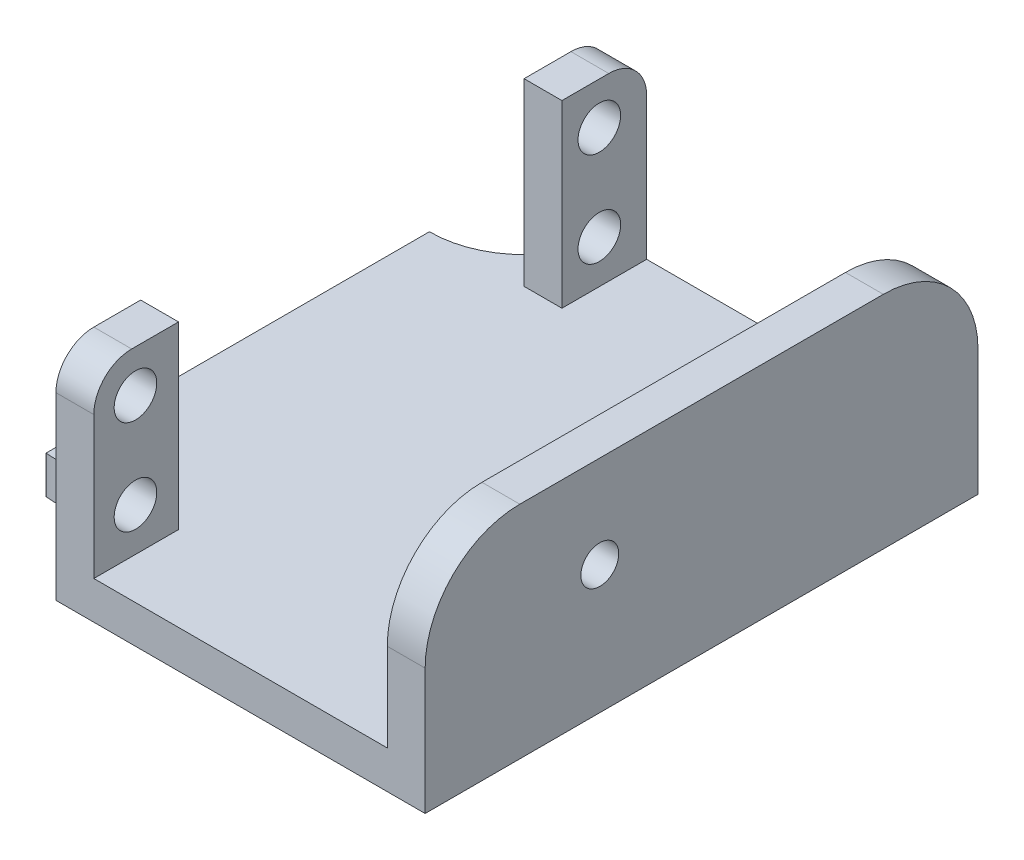
ISO-10303-21;
HEADER;
FILE_DESCRIPTION(('STEP AP214'),'2;1');
FILE_NAME('part.step','',(''),(''),'','','');
FILE_SCHEMA(('AUTOMOTIVE_DESIGN { 1 0 10303 214 1 1 1 1 }'));
ENDSEC;
DATA;
#1=APPLICATION_CONTEXT('core data for automotive mechanical design processes');
#2=APPLICATION_PROTOCOL_DEFINITION('international standard','automotive_design',2000,#1);
#3=PRODUCT_CONTEXT('',#1,'mechanical');
#4=PRODUCT('Part','Part','',(#3));
#5=PRODUCT_RELATED_PRODUCT_CATEGORY('part','',(#4));
#6=PRODUCT_DEFINITION_FORMATION('','',#4);
#7=PRODUCT_DEFINITION_CONTEXT('part definition',#1,'design');
#8=PRODUCT_DEFINITION('design','',#6,#7);
#9=PRODUCT_DEFINITION_SHAPE('','',#8);
#10=(LENGTH_UNIT() NAMED_UNIT(*) SI_UNIT(.MILLI.,.METRE.));
#11=(NAMED_UNIT(*) PLANE_ANGLE_UNIT() SI_UNIT($,.RADIAN.));
#12=(NAMED_UNIT(*) SI_UNIT($,.STERADIAN.) SOLID_ANGLE_UNIT());
#13=UNCERTAINTY_MEASURE_WITH_UNIT(LENGTH_MEASURE(1.E-05),#10,'distance_accuracy_value','');
#14=(GEOMETRIC_REPRESENTATION_CONTEXT(3) GLOBAL_UNCERTAINTY_ASSIGNED_CONTEXT((#13)) GLOBAL_UNIT_ASSIGNED_CONTEXT((#10,
#11,#12)) REPRESENTATION_CONTEXT('',''));
#15=CARTESIAN_POINT('',(0.,0.,0.));
#16=DIRECTION('',(0.,0.,1.));
#17=DIRECTION('',(1.,0.,0.));
#18=AXIS2_PLACEMENT_3D('',#15,#16,#17);
#19=CARTESIAN_POINT('',(0.,4.,0.));
#20=DIRECTION('',(0.,-1.,0.));
#21=DIRECTION('',(0.,0.,-1.));
#22=AXIS2_PLACEMENT_3D('',#19,#20,#21);
#23=PLANE('',#22);
#24=DIRECTION('',(0.,0.,-1.));
#25=VECTOR('',#24,1.);
#26=CARTESIAN_POINT('',(-4.,4.,0.));
#27=LINE('',#26,#25);
#28=CARTESIAN_POINT('',(-4.,4.,0.));
#29=VERTEX_POINT('',#28);
#30=CARTESIAN_POINT('',(-4.,4.,-58.4));
#31=VERTEX_POINT('',#30);
#32=EDGE_CURVE('E198',#29,#31,#27,.T.);
#33=ORIENTED_EDGE('',*,*,#32,.T.);
#34=DIRECTION('',(-1.,0.,0.));
#35=VECTOR('',#34,1.);
#36=CARTESIAN_POINT('',(-39.,4.,-58.4));
#37=LINE('',#36,#35);
#38=CARTESIAN_POINT('',(-35.,4.,-58.4));
#39=VERTEX_POINT('',#38);
#40=EDGE_CURVE('E184',#31,#39,#37,.T.);
#41=ORIENTED_EDGE('',*,*,#40,.T.);
#42=DIRECTION('',(0.,0.,1.));
#43=VECTOR('',#42,1.);
#44=CARTESIAN_POINT('',(-35.,4.,-58.4));
#45=LINE('',#44,#43);
#46=CARTESIAN_POINT('',(-35.,4.,-49.45));
#47=VERTEX_POINT('',#46);
#48=EDGE_CURVE('E228',#39,#47,#45,.T.);
#49=ORIENTED_EDGE('',*,*,#48,.T.);
#50=DIRECTION('',(-1.,0.,0.));
#51=VECTOR('',#50,1.);
#52=CARTESIAN_POINT('',(-35.,4.,-49.45));
#53=LINE('',#52,#51);
#54=CARTESIAN_POINT('',(-39.,4.,-49.45));
#55=VERTEX_POINT('',#54);
#56=EDGE_CURVE('E237',#47,#55,#53,.T.);
#57=ORIENTED_EDGE('',*,*,#56,.T.);
#58=DIRECTION('',(0.,0.,1.));
#59=VECTOR('',#58,1.);
#60=CARTESIAN_POINT('',(-39.,4.,0.));
#61=LINE('',#60,#59);
#62=CARTESIAN_POINT('',(-39.,4.,-58.4));
#63=VERTEX_POINT('',#62);
#64=EDGE_CURVE('E323',#63,#55,#61,.T.);
#65=ORIENTED_EDGE('',*,*,#64,.F.);
#66=CARTESIAN_POINT('',(-48.9447222183428,4.,-59.45));
#67=DIRECTION('',(0.,-1.,0.));
#68=DIRECTION('',(0.,0.,-1.));
#69=AXIS2_PLACEMENT_3D('',#66,#67,#68);
#70=CIRCLE('',#69,10.);
#71=CARTESIAN_POINT('',(-48.9447222183428,4.,-49.45));
#72=VERTEX_POINT('',#71);
#73=EDGE_CURVE('E332',#63,#72,#70,.T.);
#74=ORIENTED_EDGE('',*,*,#73,.T.);
#75=DIRECTION('',(-1.,0.,0.));
#76=VECTOR('',#75,1.);
#77=CARTESIAN_POINT('',(-49.,4.,-49.45));
#78=LINE('',#77,#76);
#79=CARTESIAN_POINT('',(-49.,4.,-49.45));
#80=VERTEX_POINT('',#79);
#81=EDGE_CURVE('E193',#72,#80,#78,.T.);
#82=ORIENTED_EDGE('',*,*,#81,.T.);
#83=DIRECTION('',(0.,0.,1.));
#84=VECTOR('',#83,1.);
#85=CARTESIAN_POINT('',(-49.,4.,-8.95));
#86=LINE('',#85,#84);
#87=CARTESIAN_POINT('',(-49.,4.,-8.95));
#88=VERTEX_POINT('',#87);
#89=EDGE_CURVE('E280',#80,#88,#86,.T.);
#90=ORIENTED_EDGE('',*,*,#89,.T.);
#91=DIRECTION('',(1.,0.,0.));
#92=VECTOR('',#91,1.);
#93=CARTESIAN_POINT('',(-39.,4.,-8.95));
#94=LINE('',#93,#92);
#95=CARTESIAN_POINT('',(-48.9447222183428,4.,-8.95));
#96=VERTEX_POINT('',#95);
#97=EDGE_CURVE('E283',#88,#96,#94,.T.);
#98=ORIENTED_EDGE('',*,*,#97,.T.);
#99=CARTESIAN_POINT('',(-48.9447222183428,4.,1.05000000000001));
#100=DIRECTION('',(0.,-1.,0.));
#101=DIRECTION('',(0.,0.,-1.));
#102=AXIS2_PLACEMENT_3D('',#99,#100,#101);
#103=CIRCLE('',#102,10.);
#104=CARTESIAN_POINT('',(-39.,4.,0.));
#105=VERTEX_POINT('',#104);
#106=EDGE_CURVE('E336',#96,#105,#103,.T.);
#107=ORIENTED_EDGE('',*,*,#106,.T.);
#108=DIRECTION('',(0.,0.,1.));
#109=VECTOR('',#108,1.);
#110=CARTESIAN_POINT('',(-39.,4.,0.));
#111=LINE('',#110,#109);
#112=CARTESIAN_POINT('',(-39.,4.,-8.95));
#113=VERTEX_POINT('',#112);
#114=EDGE_CURVE('E325',#113,#105,#111,.T.);
#115=ORIENTED_EDGE('',*,*,#114,.F.);
#116=DIRECTION('',(-1.,0.,0.));
#117=VECTOR('',#116,1.);
#118=CARTESIAN_POINT('',(-35.,4.,-8.95));
#119=LINE('',#118,#117);
#120=CARTESIAN_POINT('',(-35.,4.,-8.95));
#121=VERTEX_POINT('',#120);
#122=EDGE_CURVE('E270',#121,#113,#119,.T.);
#123=ORIENTED_EDGE('',*,*,#122,.F.);
#124=DIRECTION('',(0.,0.,1.));
#125=VECTOR('',#124,1.);
#126=CARTESIAN_POINT('',(-35.,4.,-8.95));
#127=LINE('',#126,#125);
#128=CARTESIAN_POINT('',(-35.,4.,0.));
#129=VERTEX_POINT('',#128);
#130=EDGE_CURVE('E262',#121,#129,#127,.T.);
#131=ORIENTED_EDGE('',*,*,#130,.T.);
#132=DIRECTION('',(1.,0.,0.));
#133=VECTOR('',#132,1.);
#134=CARTESIAN_POINT('',(0.,4.,0.));
#135=LINE('',#134,#133);
#136=EDGE_CURVE('E194',#129,#29,#135,.T.);
#137=ORIENTED_EDGE('',*,*,#136,.T.);
#138=EDGE_LOOP('',(#33,#41,#49,#57,#65,#74,#82,#90,#98,#107,#115,#123,#131,#137));
#139=FACE_BOUND('',#138,.T.);
#140=ADVANCED_FACE('F39',(#139),#23,.F.);
#141=CARTESIAN_POINT('',(-49.,4.,-8.95));
#142=DIRECTION('',(1.,0.,0.));
#143=DIRECTION('',(0.,0.,-1.));
#144=AXIS2_PLACEMENT_3D('',#141,#142,#143);
#145=PLANE('',#144);
#146=DIRECTION('',(0.,0.,1.));
#147=VECTOR('',#146,1.);
#148=CARTESIAN_POINT('',(-49.,0.,-8.95));
#149=LINE('',#148,#147);
#150=CARTESIAN_POINT('',(-49.,0.,-49.45));
#151=VERTEX_POINT('',#150);
#152=CARTESIAN_POINT('',(-49.,0.,-8.95));
#153=VERTEX_POINT('',#152);
#154=EDGE_CURVE('E277',#151,#153,#149,.T.);
#155=ORIENTED_EDGE('',*,*,#154,.T.);
#156=DIRECTION('',(0.,-1.,0.));
#157=VECTOR('',#156,1.);
#158=CARTESIAN_POINT('',(-49.,4.,-8.95));
#159=LINE('',#158,#157);
#160=EDGE_CURVE('E317',#88,#153,#159,.T.);
#161=ORIENTED_EDGE('',*,*,#160,.F.);
#162=ORIENTED_EDGE('',*,*,#89,.F.);
#163=DIRECTION('',(0.,-1.,0.));
#164=VECTOR('',#163,1.);
#165=CARTESIAN_POINT('',(-49.,4.,-49.45));
#166=LINE('',#165,#164);
#167=EDGE_CURVE('E289',#80,#151,#166,.T.);
#168=ORIENTED_EDGE('',*,*,#167,.T.);
#169=EDGE_LOOP('',(#155,#161,#162,#168));
#170=FACE_BOUND('',#169,.T.);
#171=ADVANCED_FACE('F397',(#170),#145,.F.);
#172=CARTESIAN_POINT('',(-39.,4.,-8.95));
#173=DIRECTION('',(0.,0.,-1.));
#174=DIRECTION('',(-1.,0.,0.));
#175=AXIS2_PLACEMENT_3D('',#172,#173,#174);
#176=PLANE('',#175);
#177=DIRECTION('',(1.,0.,0.));
#178=VECTOR('',#177,1.);
#179=CARTESIAN_POINT('',(-39.,0.,-8.95));
#180=LINE('',#179,#178);
#181=CARTESIAN_POINT('',(-48.9447222183428,0.,-8.95));
#182=VERTEX_POINT('',#181);
#183=EDGE_CURVE('E292',#153,#182,#180,.T.);
#184=ORIENTED_EDGE('',*,*,#183,.T.);
#185=DIRECTION('',(0.,1.,0.));
#186=VECTOR('',#185,1.);
#187=CARTESIAN_POINT('',(-48.9447222183428,4.,-8.95));
#188=LINE('',#187,#186);
#189=EDGE_CURVE('E328',#182,#96,#188,.T.);
#190=ORIENTED_EDGE('',*,*,#189,.T.);
#191=ORIENTED_EDGE('',*,*,#97,.F.);
#192=ORIENTED_EDGE('',*,*,#160,.T.);
#193=EDGE_LOOP('',(#184,#190,#191,#192));
#194=FACE_BOUND('',#193,.T.);
#195=ADVANCED_FACE('F402',(#194),#176,.F.);
#196=CARTESIAN_POINT('',(-39.,4.,0.));
#197=DIRECTION('',(1.,0.,0.));
#198=DIRECTION('',(0.,0.,-1.));
#199=AXIS2_PLACEMENT_3D('',#196,#197,#198);
#200=PLANE('',#199);
#201=DIRECTION('',(0.,-1.,0.));
#202=VECTOR('',#201,1.);
#203=CARTESIAN_POINT('',(-39.,4.,0.));
#204=LINE('',#203,#202);
#205=CARTESIAN_POINT('',(-39.,19.,0.));
#206=VERTEX_POINT('',#205);
#207=EDGE_CURVE('E315',#206,#105,#204,.T.);
#208=ORIENTED_EDGE('',*,*,#207,.F.);
#209=CARTESIAN_POINT('',(-39.,19.,-3.99999999999999));
#210=DIRECTION('',(1.,0.,0.));
#211=DIRECTION('',(0.,0.,-1.));
#212=AXIS2_PLACEMENT_3D('',#209,#210,#211);
#213=CIRCLE('',#212,4.);
#214=CARTESIAN_POINT('',(-39.,23.,-3.99999999999999));
#215=VERTEX_POINT('',#214);
#216=EDGE_CURVE('E351',#206,#215,#213,.F.);
#217=ORIENTED_EDGE('',*,*,#216,.T.);
#218=DIRECTION('',(0.,0.,-1.));
#219=VECTOR('',#218,1.);
#220=CARTESIAN_POINT('',(-39.,23.,-8.95));
#221=LINE('',#220,#219);
#222=CARTESIAN_POINT('',(-39.,23.,-8.95));
#223=VERTEX_POINT('',#222);
#224=EDGE_CURVE('E263',#215,#223,#221,.T.);
#225=ORIENTED_EDGE('',*,*,#224,.T.);
#226=DIRECTION('',(0.,-1.,0.));
#227=VECTOR('',#226,1.);
#228=CARTESIAN_POINT('',(-39.,23.,-8.95));
#229=LINE('',#228,#227);
#230=EDGE_CURVE('E256',#223,#113,#229,.T.);
#231=ORIENTED_EDGE('',*,*,#230,.T.);
#232=ORIENTED_EDGE('',*,*,#114,.T.);
#233=EDGE_LOOP('',(#208,#217,#225,#231,#232));
#234=FACE_BOUND('',#233,.T.);
#235=CARTESIAN_POINT('',(-39.,8.55,-4.39999999999999));
#236=DIRECTION('',(-1.,0.,0.));
#237=DIRECTION('',(0.,0.,1.));
#238=AXIS2_PLACEMENT_3D('',#235,#236,#237);
#239=CIRCLE('',#238,2.25);
#240=CARTESIAN_POINT('',(-39.,8.55,-2.14999999999999));
#241=VERTEX_POINT('',#240);
#242=EDGE_CURVE('E244',#241,#241,#239,.T.);
#243=ORIENTED_EDGE('',*,*,#242,.F.);
#244=EDGE_LOOP('',(#243));
#245=FACE_BOUND('',#244,.T.);
#246=CARTESIAN_POINT('',(-39.,18.55,-4.39999999999999));
#247=DIRECTION('',(-1.,0.,0.));
#248=DIRECTION('',(0.,0.,1.));
#249=AXIS2_PLACEMENT_3D('',#246,#247,#248);
#250=CIRCLE('',#249,2.25);
#251=CARTESIAN_POINT('',(-39.,18.55,-2.14999999999998));
#252=VERTEX_POINT('',#251);
#253=EDGE_CURVE('E250',#252,#252,#250,.T.);
#254=ORIENTED_EDGE('',*,*,#253,.F.);
#255=EDGE_LOOP('',(#254));
#256=FACE_BOUND('',#255,.T.);
#257=ADVANCED_FACE('F425',(#234,#245,#256),#200,.F.);
#258=CARTESIAN_POINT('',(0.,4.,0.));
#259=DIRECTION('',(0.,0.,-1.));
#260=DIRECTION('',(-1.,0.,0.));
#261=AXIS2_PLACEMENT_3D('',#258,#259,#260);
#262=PLANE('',#261);
#263=DIRECTION('',(0.,-1.,0.));
#264=VECTOR('',#263,1.);
#265=CARTESIAN_POINT('',(0.,4.,0.));
#266=LINE('',#265,#264);
#267=CARTESIAN_POINT('',(0.,13.3,0.));
#268=VERTEX_POINT('',#267);
#269=CARTESIAN_POINT('',(0.,0.,0.));
#270=VERTEX_POINT('',#269);
#271=EDGE_CURVE('E312',#268,#270,#266,.T.);
#272=ORIENTED_EDGE('',*,*,#271,.F.);
#273=DIRECTION('',(1.,0.,0.));
#274=VECTOR('',#273,1.);
#275=CARTESIAN_POINT('',(-4.,13.3,0.));
#276=LINE('',#275,#274);
#277=CARTESIAN_POINT('',(-4.,13.3,0.));
#278=VERTEX_POINT('',#277);
#279=EDGE_CURVE('E62',#268,#278,#276,.F.);
#280=ORIENTED_EDGE('',*,*,#279,.T.);
#281=DIRECTION('',(0.,-1.,0.));
#282=VECTOR('',#281,1.);
#283=CARTESIAN_POINT('',(-4.,23.3,0.));
#284=LINE('',#283,#282);
#285=EDGE_CURVE('E201',#278,#29,#284,.T.);
#286=ORIENTED_EDGE('',*,*,#285,.T.);
#287=ORIENTED_EDGE('',*,*,#136,.F.);
#288=DIRECTION('',(0.,1.,0.));
#289=VECTOR('',#288,1.);
#290=CARTESIAN_POINT('',(-35.,23.,0.));
#291=LINE('',#290,#289);
#292=CARTESIAN_POINT('',(-35.,19.,0.));
#293=VERTEX_POINT('',#292);
#294=EDGE_CURVE('E265',#129,#293,#291,.T.);
#295=ORIENTED_EDGE('',*,*,#294,.T.);
#296=DIRECTION('',(-1.,0.,0.));
#297=VECTOR('',#296,1.);
#298=CARTESIAN_POINT('',(-39.,19.,0.));
#299=LINE('',#298,#297);
#300=EDGE_CURVE('E348',#293,#206,#299,.T.);
#301=ORIENTED_EDGE('',*,*,#300,.T.);
#302=ORIENTED_EDGE('',*,*,#207,.T.);
#303=CARTESIAN_POINT('',(-39.,0.,0.));
#304=VERTEX_POINT('',#303);
#305=EDGE_CURVE('E314',#105,#304,#204,.T.);
#306=ORIENTED_EDGE('',*,*,#305,.T.);
#307=DIRECTION('',(1.,0.,0.));
#308=VECTOR('',#307,1.);
#309=CARTESIAN_POINT('',(0.,0.,0.));
#310=LINE('',#309,#308);
#311=EDGE_CURVE('E295',#304,#270,#310,.T.);
#312=ORIENTED_EDGE('',*,*,#311,.T.);
#313=EDGE_LOOP('',(#272,#280,#286,#287,#295,#301,#302,#306,#312));
#314=FACE_BOUND('',#313,.T.);
#315=ADVANCED_FACE('F378',(#314),#262,.F.);
#316=CARTESIAN_POINT('',(0.,4.,-58.4));
#317=DIRECTION('',(-1.,0.,0.));
#318=DIRECTION('',(0.,0.,1.));
#319=AXIS2_PLACEMENT_3D('',#316,#317,#318);
#320=PLANE('',#319);
#321=DIRECTION('',(0.,0.,1.));
#322=VECTOR('',#321,1.);
#323=CARTESIAN_POINT('',(0.,23.3,0.));
#324=LINE('',#323,#322);
#325=CARTESIAN_POINT('',(0.,23.3,-48.4));
#326=VERTEX_POINT('',#325);
#327=CARTESIAN_POINT('',(0.,23.3,-9.99999999999999));
#328=VERTEX_POINT('',#327);
#329=EDGE_CURVE('E211',#326,#328,#324,.T.);
#330=ORIENTED_EDGE('',*,*,#329,.T.);
#331=CARTESIAN_POINT('',(0.,13.3,-9.99999999999999));
#332=DIRECTION('',(-1.,0.,0.));
#333=DIRECTION('',(0.,0.,1.));
#334=AXIS2_PLACEMENT_3D('',#331,#332,#333);
#335=CIRCLE('',#334,10.);
#336=EDGE_CURVE('E364',#328,#268,#335,.F.);
#337=ORIENTED_EDGE('',*,*,#336,.T.);
#338=ORIENTED_EDGE('',*,*,#271,.T.);
#339=DIRECTION('',(0.,0.,-1.));
#340=VECTOR('',#339,1.);
#341=CARTESIAN_POINT('',(0.,0.,-58.4));
#342=LINE('',#341,#340);
#343=CARTESIAN_POINT('',(0.,0.,-58.4));
#344=VERTEX_POINT('',#343);
#345=EDGE_CURVE('E298',#270,#344,#342,.T.);
#346=ORIENTED_EDGE('',*,*,#345,.T.);
#347=DIRECTION('',(0.,-1.,0.));
#348=VECTOR('',#347,1.);
#349=CARTESIAN_POINT('',(0.,4.,-58.4));
#350=LINE('',#349,#348);
#351=CARTESIAN_POINT('',(0.,13.3,-58.4));
#352=VERTEX_POINT('',#351);
#353=EDGE_CURVE('E310',#352,#344,#350,.T.);
#354=ORIENTED_EDGE('',*,*,#353,.F.);
#355=CARTESIAN_POINT('',(0.,13.3,-48.4));
#356=DIRECTION('',(-1.,0.,0.));
#357=DIRECTION('',(0.,0.,1.));
#358=AXIS2_PLACEMENT_3D('',#355,#356,#357);
#359=CIRCLE('',#358,10.);
#360=EDGE_CURVE('E362',#352,#326,#359,.F.);
#361=ORIENTED_EDGE('',*,*,#360,.T.);
#362=EDGE_LOOP('',(#330,#337,#338,#346,#354,#361));
#363=FACE_BOUND('',#362,.T.);
#364=CARTESIAN_POINT('',(0.,13.55,-18.45));
#365=DIRECTION('',(1.,0.,0.));
#366=DIRECTION('',(0.,0.,-1.));
#367=AXIS2_PLACEMENT_3D('',#364,#365,#366);
#368=CIRCLE('',#367,2.);
#369=CARTESIAN_POINT('',(0.,13.55,-20.45));
#370=VERTEX_POINT('',#369);
#371=EDGE_CURVE('E461',#370,#370,#368,.T.);
#372=ORIENTED_EDGE('',*,*,#371,.F.);
#373=EDGE_LOOP('',(#372));
#374=FACE_BOUND('',#373,.T.);
#375=ADVANCED_FACE('F376',(#363,#374),#320,.F.);
#376=CARTESIAN_POINT('',(-39.,4.,-58.4));
#377=DIRECTION('',(0.,0.,1.));
#378=DIRECTION('',(1.,0.,0.));
#379=AXIS2_PLACEMENT_3D('',#376,#377,#378);
#380=PLANE('',#379);
#381=DIRECTION('',(0.,1.,0.));
#382=VECTOR('',#381,1.);
#383=CARTESIAN_POINT('',(-4.,23.3,-58.4));
#384=LINE('',#383,#382);
#385=CARTESIAN_POINT('',(-4.,13.3,-58.4));
#386=VERTEX_POINT('',#385);
#387=EDGE_CURVE('E187',#31,#386,#384,.T.);
#388=ORIENTED_EDGE('',*,*,#387,.T.);
#389=DIRECTION('',(1.,0.,0.));
#390=VECTOR('',#389,1.);
#391=CARTESIAN_POINT('',(0.,13.3,-58.4));
#392=LINE('',#391,#390);
#393=EDGE_CURVE('E11',#386,#352,#392,.T.);
#394=ORIENTED_EDGE('',*,*,#393,.T.);
#395=ORIENTED_EDGE('',*,*,#353,.T.);
#396=DIRECTION('',(-1.,0.,0.));
#397=VECTOR('',#396,1.);
#398=CARTESIAN_POINT('',(-39.,0.,-58.4));
#399=LINE('',#398,#397);
#400=CARTESIAN_POINT('',(-39.,0.,-58.4));
#401=VERTEX_POINT('',#400);
#402=EDGE_CURVE('E301',#344,#401,#399,.T.);
#403=ORIENTED_EDGE('',*,*,#402,.T.);
#404=DIRECTION('',(0.,-1.,0.));
#405=VECTOR('',#404,1.);
#406=CARTESIAN_POINT('',(-39.,4.,-58.4));
#407=LINE('',#406,#405);
#408=EDGE_CURVE('E307',#63,#401,#407,.T.);
#409=ORIENTED_EDGE('',*,*,#408,.F.);
#410=CARTESIAN_POINT('',(-39.,19.,-58.4));
#411=VERTEX_POINT('',#410);
#412=EDGE_CURVE('E308',#411,#63,#407,.T.);
#413=ORIENTED_EDGE('',*,*,#412,.F.);
#414=DIRECTION('',(-1.,0.,0.));
#415=VECTOR('',#414,1.);
#416=CARTESIAN_POINT('',(-35.,19.,-58.4));
#417=LINE('',#416,#415);
#418=CARTESIAN_POINT('',(-35.,19.,-58.4));
#419=VERTEX_POINT('',#418);
#420=EDGE_CURVE('E344',#411,#419,#417,.F.);
#421=ORIENTED_EDGE('',*,*,#420,.T.);
#422=DIRECTION('',(0.,-1.,0.));
#423=VECTOR('',#422,1.);
#424=CARTESIAN_POINT('',(-35.,23.,-58.4));
#425=LINE('',#424,#423);
#426=EDGE_CURVE('E190',#419,#39,#425,.T.);
#427=ORIENTED_EDGE('',*,*,#426,.T.);
#428=ORIENTED_EDGE('',*,*,#40,.F.);
#429=EDGE_LOOP('',(#388,#394,#395,#403,#409,#413,#421,#427,#428));
#430=FACE_BOUND('',#429,.T.);
#431=ADVANCED_FACE('F186',(#430),#380,.F.);
#432=CARTESIAN_POINT('',(-39.,4.,-49.45));
#433=DIRECTION('',(1.,0.,0.));
#434=DIRECTION('',(0.,0.,-1.));
#435=AXIS2_PLACEMENT_3D('',#432,#433,#434);
#436=PLANE('',#435);
#437=DIRECTION('',(0.,0.,-1.));
#438=VECTOR('',#437,1.);
#439=CARTESIAN_POINT('',(-39.,23.,-58.4));
#440=LINE('',#439,#438);
#441=CARTESIAN_POINT('',(-39.,23.,-49.45));
#442=VERTEX_POINT('',#441);
#443=CARTESIAN_POINT('',(-39.,23.,-54.4));
#444=VERTEX_POINT('',#443);
#445=EDGE_CURVE('E229',#442,#444,#440,.T.);
#446=ORIENTED_EDGE('',*,*,#445,.T.);
#447=CARTESIAN_POINT('',(-39.,19.,-54.4));
#448=DIRECTION('',(1.,0.,0.));
#449=DIRECTION('',(0.,0.,-1.));
#450=AXIS2_PLACEMENT_3D('',#447,#448,#449);
#451=CIRCLE('',#450,4.);
#452=EDGE_CURVE('E342',#444,#411,#451,.F.);
#453=ORIENTED_EDGE('',*,*,#452,.T.);
#454=ORIENTED_EDGE('',*,*,#412,.T.);
#455=ORIENTED_EDGE('',*,*,#64,.T.);
#456=DIRECTION('',(0.,1.,0.));
#457=VECTOR('',#456,1.);
#458=CARTESIAN_POINT('',(-39.,23.,-49.45));
#459=LINE('',#458,#457);
#460=EDGE_CURVE('E224',#55,#442,#459,.T.);
#461=ORIENTED_EDGE('',*,*,#460,.T.);
#462=EDGE_LOOP('',(#446,#453,#454,#455,#461));
#463=FACE_BOUND('',#462,.T.);
#464=CARTESIAN_POINT('',(-39.,8.55,-53.4));
#465=DIRECTION('',(-1.,0.,0.));
#466=DIRECTION('',(0.,0.,1.));
#467=AXIS2_PLACEMENT_3D('',#464,#465,#466);
#468=CIRCLE('',#467,2.25);
#469=CARTESIAN_POINT('',(-39.,8.55,-51.15));
#470=VERTEX_POINT('',#469);
#471=EDGE_CURVE('E207',#470,#470,#468,.T.);
#472=ORIENTED_EDGE('',*,*,#471,.F.);
#473=EDGE_LOOP('',(#472));
#474=FACE_BOUND('',#473,.T.);
#475=CARTESIAN_POINT('',(-39.,18.55,-53.4));
#476=DIRECTION('',(-1.,0.,0.));
#477=DIRECTION('',(0.,0.,1.));
#478=AXIS2_PLACEMENT_3D('',#475,#476,#477);
#479=CIRCLE('',#478,2.25);
#480=CARTESIAN_POINT('',(-39.,18.55,-51.15));
#481=VERTEX_POINT('',#480);
#482=EDGE_CURVE('E218',#481,#481,#479,.T.);
#483=ORIENTED_EDGE('',*,*,#482,.F.);
#484=EDGE_LOOP('',(#483));
#485=FACE_BOUND('',#484,.T.);
#486=ADVANCED_FACE('F414',(#463,#474,#485),#436,.F.);
#487=CARTESIAN_POINT('',(-49.,4.,-49.45));
#488=DIRECTION('',(0.,0.,1.));
#489=DIRECTION('',(1.,0.,0.));
#490=AXIS2_PLACEMENT_3D('',#487,#488,#489);
#491=PLANE('',#490);
#492=ORIENTED_EDGE('',*,*,#81,.F.);
#493=DIRECTION('',(0.,-1.,0.));
#494=VECTOR('',#493,1.);
#495=CARTESIAN_POINT('',(-48.9447222183428,4.,-49.45));
#496=LINE('',#495,#494);
#497=CARTESIAN_POINT('',(-48.9447222183428,0.,-49.45));
#498=VERTEX_POINT('',#497);
#499=EDGE_CURVE('E320',#72,#498,#496,.T.);
#500=ORIENTED_EDGE('',*,*,#499,.T.);
#501=DIRECTION('',(-1.,0.,0.));
#502=VECTOR('',#501,1.);
#503=CARTESIAN_POINT('',(-49.,0.,-49.45));
#504=LINE('',#503,#502);
#505=EDGE_CURVE('E284',#498,#151,#504,.T.);
#506=ORIENTED_EDGE('',*,*,#505,.T.);
#507=ORIENTED_EDGE('',*,*,#167,.F.);
#508=EDGE_LOOP('',(#492,#500,#506,#507));
#509=FACE_BOUND('',#508,.T.);
#510=ADVANCED_FACE('F411',(#509),#491,.F.);
#511=CARTESIAN_POINT('',(0.,0.,0.));
#512=DIRECTION('',(0.,-1.,0.));
#513=DIRECTION('',(0.,0.,-1.));
#514=AXIS2_PLACEMENT_3D('',#511,#512,#513);
#515=PLANE('',#514);
#516=ORIENTED_EDGE('',*,*,#154,.F.);
#517=ORIENTED_EDGE('',*,*,#505,.F.);
#518=CARTESIAN_POINT('',(-48.9447222183428,0.,-59.45));
#519=DIRECTION('',(0.,-1.,0.));
#520=DIRECTION('',(0.,0.,-1.));
#521=AXIS2_PLACEMENT_3D('',#518,#519,#520);
#522=CIRCLE('',#521,10.);
#523=EDGE_CURVE('E330',#498,#401,#522,.F.);
#524=ORIENTED_EDGE('',*,*,#523,.T.);
#525=ORIENTED_EDGE('',*,*,#402,.F.);
#526=ORIENTED_EDGE('',*,*,#345,.F.);
#527=ORIENTED_EDGE('',*,*,#311,.F.);
#528=CARTESIAN_POINT('',(-48.9447222183428,0.,1.05000000000001));
#529=DIRECTION('',(0.,-1.,0.));
#530=DIRECTION('',(0.,0.,-1.));
#531=AXIS2_PLACEMENT_3D('',#528,#529,#530);
#532=CIRCLE('',#531,10.);
#533=EDGE_CURVE('E334',#304,#182,#532,.F.);
#534=ORIENTED_EDGE('',*,*,#533,.T.);
#535=ORIENTED_EDGE('',*,*,#183,.F.);
#536=EDGE_LOOP('',(#516,#517,#524,#525,#526,#527,#534,#535));
#537=FACE_BOUND('',#536,.T.);
#538=ADVANCED_FACE('F386',(#537),#515,.T.);
#539=CARTESIAN_POINT('',(-35.,23.,-8.95));
#540=DIRECTION('',(0.,0.,-1.));
#541=DIRECTION('',(0.,1.,0.));
#542=AXIS2_PLACEMENT_3D('',#539,#540,#541);
#543=PLANE('',#542);
#544=ORIENTED_EDGE('',*,*,#230,.F.);
#545=DIRECTION('',(-1.,0.,0.));
#546=VECTOR('',#545,1.);
#547=CARTESIAN_POINT('',(-35.,23.,-8.95));
#548=LINE('',#547,#546);
#549=CARTESIAN_POINT('',(-35.,23.,-8.95));
#550=VERTEX_POINT('',#549);
#551=EDGE_CURVE('E274',#550,#223,#548,.T.);
#552=ORIENTED_EDGE('',*,*,#551,.F.);
#553=DIRECTION('',(0.,-1.,0.));
#554=VECTOR('',#553,1.);
#555=CARTESIAN_POINT('',(-35.,23.,-8.95));
#556=LINE('',#555,#554);
#557=EDGE_CURVE('E259',#550,#121,#556,.T.);
#558=ORIENTED_EDGE('',*,*,#557,.T.);
#559=ORIENTED_EDGE('',*,*,#122,.T.);
#560=EDGE_LOOP('',(#544,#552,#558,#559));
#561=FACE_BOUND('',#560,.T.);
#562=ADVANCED_FACE('F407',(#561),#543,.T.);
#563=CARTESIAN_POINT('',(-35.,23.,-8.95));
#564=DIRECTION('',(0.,1.,0.));
#565=DIRECTION('',(0.,0.,1.));
#566=AXIS2_PLACEMENT_3D('',#563,#564,#565);
#567=PLANE('',#566);
#568=ORIENTED_EDGE('',*,*,#224,.F.);
#569=DIRECTION('',(-1.,0.,0.));
#570=VECTOR('',#569,1.);
#571=CARTESIAN_POINT('',(-35.,23.,-3.99999999999999));
#572=LINE('',#571,#570);
#573=CARTESIAN_POINT('',(-35.,23.,-4.));
#574=VERTEX_POINT('',#573);
#575=EDGE_CURVE('E353',#215,#574,#572,.F.);
#576=ORIENTED_EDGE('',*,*,#575,.T.);
#577=DIRECTION('',(0.,0.,-1.));
#578=VECTOR('',#577,1.);
#579=CARTESIAN_POINT('',(-35.,23.,-8.95));
#580=LINE('',#579,#578);
#581=EDGE_CURVE('E268',#574,#550,#580,.T.);
#582=ORIENTED_EDGE('',*,*,#581,.T.);
#583=ORIENTED_EDGE('',*,*,#551,.T.);
#584=EDGE_LOOP('',(#568,#576,#582,#583));
#585=FACE_BOUND('',#584,.T.);
#586=ADVANCED_FACE('F505',(#585),#567,.T.);
#587=CARTESIAN_POINT('',(-35.,0.,0.));
#588=DIRECTION('',(-1.,0.,0.));
#589=DIRECTION('',(0.,0.,1.));
#590=AXIS2_PLACEMENT_3D('',#587,#588,#589);
#591=PLANE('',#590);
#592=CARTESIAN_POINT('',(-35.,8.55,-4.39999999999999));
#593=DIRECTION('',(-1.,0.,0.));
#594=DIRECTION('',(0.,0.,1.));
#595=AXIS2_PLACEMENT_3D('',#592,#593,#594);
#596=CIRCLE('',#595,2.25);
#597=CARTESIAN_POINT('',(-35.,8.55,-2.14999999999999));
#598=VERTEX_POINT('',#597);
#599=EDGE_CURVE('E247',#598,#598,#596,.T.);
#600=ORIENTED_EDGE('',*,*,#599,.T.);
#601=EDGE_LOOP('',(#600));
#602=FACE_BOUND('',#601,.T.);
#603=CARTESIAN_POINT('',(-35.,18.55,-4.39999999999999));
#604=DIRECTION('',(-1.,0.,0.));
#605=DIRECTION('',(0.,0.,1.));
#606=AXIS2_PLACEMENT_3D('',#603,#604,#605);
#607=CIRCLE('',#606,2.25);
#608=CARTESIAN_POINT('',(-35.,18.55,-2.14999999999998));
#609=VERTEX_POINT('',#608);
#610=EDGE_CURVE('E253',#609,#609,#607,.T.);
#611=ORIENTED_EDGE('',*,*,#610,.T.);
#612=EDGE_LOOP('',(#611));
#613=FACE_BOUND('',#612,.T.);
#614=ORIENTED_EDGE('',*,*,#581,.F.);
#615=CARTESIAN_POINT('',(-35.,19.,-3.99999999999999));
#616=DIRECTION('',(-1.,0.,0.));
#617=DIRECTION('',(0.,0.,1.));
#618=AXIS2_PLACEMENT_3D('',#615,#616,#617);
#619=CIRCLE('',#618,4.);
#620=EDGE_CURVE('E355',#574,#293,#619,.F.);
#621=ORIENTED_EDGE('',*,*,#620,.T.);
#622=ORIENTED_EDGE('',*,*,#294,.F.);
#623=ORIENTED_EDGE('',*,*,#130,.F.);
#624=ORIENTED_EDGE('',*,*,#557,.F.);
#625=EDGE_LOOP('',(#614,#621,#622,#623,#624));
#626=FACE_BOUND('',#625,.T.);
#627=ADVANCED_FACE('F457',(#602,#613,#626),#591,.F.);
#628=CARTESIAN_POINT('',(-35.,18.55,-4.39999999999999));
#629=DIRECTION('',(-1.,0.,0.));
#630=DIRECTION('',(0.,0.,1.));
#631=AXIS2_PLACEMENT_3D('',#628,#629,#630);
#632=CYLINDRICAL_SURFACE('',#631,2.25);
#633=ORIENTED_EDGE('',*,*,#610,.F.);
#634=EDGE_LOOP('',(#633));
#635=FACE_BOUND('',#634,.T.);
#636=ORIENTED_EDGE('',*,*,#253,.T.);
#637=EDGE_LOOP('',(#636));
#638=FACE_BOUND('',#637,.T.);
#639=ADVANCED_FACE('F499',(#635,#638),#632,.F.);
#640=CARTESIAN_POINT('',(-35.,8.55,-4.39999999999999));
#641=DIRECTION('',(-1.,0.,0.));
#642=DIRECTION('',(0.,0.,1.));
#643=AXIS2_PLACEMENT_3D('',#640,#641,#642);
#644=CYLINDRICAL_SURFACE('',#643,2.25);
#645=ORIENTED_EDGE('',*,*,#599,.F.);
#646=EDGE_LOOP('',(#645));
#647=FACE_BOUND('',#646,.T.);
#648=ORIENTED_EDGE('',*,*,#242,.T.);
#649=EDGE_LOOP('',(#648));
#650=FACE_BOUND('',#649,.T.);
#651=ADVANCED_FACE('F492',(#647,#650),#644,.F.);
#652=CARTESIAN_POINT('',(-35.,23.,-58.4));
#653=DIRECTION('',(0.,1.,0.));
#654=DIRECTION('',(0.,0.,1.));
#655=AXIS2_PLACEMENT_3D('',#652,#653,#654);
#656=PLANE('',#655);
#657=DIRECTION('',(0.,0.,-1.));
#658=VECTOR('',#657,1.);
#659=CARTESIAN_POINT('',(-35.,23.,-58.4));
#660=LINE('',#659,#658);
#661=CARTESIAN_POINT('',(-35.,23.,-49.45));
#662=VERTEX_POINT('',#661);
#663=CARTESIAN_POINT('',(-35.,23.,-54.4));
#664=VERTEX_POINT('',#663);
#665=EDGE_CURVE('E234',#662,#664,#660,.T.);
#666=ORIENTED_EDGE('',*,*,#665,.T.);
#667=DIRECTION('',(-1.,0.,0.));
#668=VECTOR('',#667,1.);
#669=CARTESIAN_POINT('',(-39.,23.,-54.4));
#670=LINE('',#669,#668);
#671=EDGE_CURVE('E339',#664,#444,#670,.T.);
#672=ORIENTED_EDGE('',*,*,#671,.T.);
#673=ORIENTED_EDGE('',*,*,#445,.F.);
#674=DIRECTION('',(-1.,0.,0.));
#675=VECTOR('',#674,1.);
#676=CARTESIAN_POINT('',(-35.,23.,-49.45));
#677=LINE('',#676,#675);
#678=EDGE_CURVE('E242',#662,#442,#677,.T.);
#679=ORIENTED_EDGE('',*,*,#678,.F.);
#680=EDGE_LOOP('',(#666,#672,#673,#679));
#681=FACE_BOUND('',#680,.T.);
#682=ADVANCED_FACE('F489',(#681),#656,.T.);
#683=CARTESIAN_POINT('',(-35.,23.,-49.45));
#684=DIRECTION('',(0.,0.,1.));
#685=DIRECTION('',(1.,0.,0.));
#686=AXIS2_PLACEMENT_3D('',#683,#684,#685);
#687=PLANE('',#686);
#688=ORIENTED_EDGE('',*,*,#460,.F.);
#689=ORIENTED_EDGE('',*,*,#56,.F.);
#690=DIRECTION('',(0.,1.,0.));
#691=VECTOR('',#690,1.);
#692=CARTESIAN_POINT('',(-35.,23.,-49.45));
#693=LINE('',#692,#691);
#694=EDGE_CURVE('E231',#47,#662,#693,.T.);
#695=ORIENTED_EDGE('',*,*,#694,.T.);
#696=ORIENTED_EDGE('',*,*,#678,.T.);
#697=EDGE_LOOP('',(#688,#689,#695,#696));
#698=FACE_BOUND('',#697,.T.);
#699=ADVANCED_FACE('F487',(#698),#687,.T.);
#700=CARTESIAN_POINT('',(-35.,0.,0.));
#701=DIRECTION('',(-1.,0.,0.));
#702=DIRECTION('',(0.,0.,1.));
#703=AXIS2_PLACEMENT_3D('',#700,#701,#702);
#704=PLANE('',#703);
#705=CARTESIAN_POINT('',(-35.,8.55,-53.4));
#706=DIRECTION('',(-1.,0.,0.));
#707=DIRECTION('',(0.,0.,1.));
#708=AXIS2_PLACEMENT_3D('',#705,#706,#707);
#709=CIRCLE('',#708,2.25);
#710=CARTESIAN_POINT('',(-35.,8.55,-51.15));
#711=VERTEX_POINT('',#710);
#712=EDGE_CURVE('E215',#711,#711,#709,.T.);
#713=ORIENTED_EDGE('',*,*,#712,.T.);
#714=EDGE_LOOP('',(#713));
#715=FACE_BOUND('',#714,.T.);
#716=CARTESIAN_POINT('',(-35.,18.55,-53.4));
#717=DIRECTION('',(-1.,0.,0.));
#718=DIRECTION('',(0.,0.,1.));
#719=AXIS2_PLACEMENT_3D('',#716,#717,#718);
#720=CIRCLE('',#719,2.25);
#721=CARTESIAN_POINT('',(-35.,18.55,-51.15));
#722=VERTEX_POINT('',#721);
#723=EDGE_CURVE('E221',#722,#722,#720,.T.);
#724=ORIENTED_EDGE('',*,*,#723,.T.);
#725=EDGE_LOOP('',(#724));
#726=FACE_BOUND('',#725,.T.);
#727=ORIENTED_EDGE('',*,*,#426,.F.);
#728=CARTESIAN_POINT('',(-35.,19.,-54.4));
#729=DIRECTION('',(-1.,0.,0.));
#730=DIRECTION('',(0.,0.,1.));
#731=AXIS2_PLACEMENT_3D('',#728,#729,#730);
#732=CIRCLE('',#731,4.);
#733=EDGE_CURVE('E346',#419,#664,#732,.F.);
#734=ORIENTED_EDGE('',*,*,#733,.T.);
#735=ORIENTED_EDGE('',*,*,#665,.F.);
#736=ORIENTED_EDGE('',*,*,#694,.F.);
#737=ORIENTED_EDGE('',*,*,#48,.F.);
#738=EDGE_LOOP('',(#727,#734,#735,#736,#737));
#739=FACE_BOUND('',#738,.T.);
#740=ADVANCED_FACE('F483',(#715,#726,#739),#704,.F.);
#741=CARTESIAN_POINT('',(-35.,18.55,-53.4));
#742=DIRECTION('',(-1.,0.,0.));
#743=DIRECTION('',(0.,0.,1.));
#744=AXIS2_PLACEMENT_3D('',#741,#742,#743);
#745=CYLINDRICAL_SURFACE('',#744,2.25);
#746=ORIENTED_EDGE('',*,*,#723,.F.);
#747=EDGE_LOOP('',(#746));
#748=FACE_BOUND('',#747,.T.);
#749=ORIENTED_EDGE('',*,*,#482,.T.);
#750=EDGE_LOOP('',(#749));
#751=FACE_BOUND('',#750,.T.);
#752=ADVANCED_FACE('F479',(#748,#751),#745,.F.);
#753=CARTESIAN_POINT('',(-35.,8.55,-53.4));
#754=DIRECTION('',(-1.,0.,0.));
#755=DIRECTION('',(0.,0.,1.));
#756=AXIS2_PLACEMENT_3D('',#753,#754,#755);
#757=CYLINDRICAL_SURFACE('',#756,2.25);
#758=ORIENTED_EDGE('',*,*,#712,.F.);
#759=EDGE_LOOP('',(#758));
#760=FACE_BOUND('',#759,.T.);
#761=ORIENTED_EDGE('',*,*,#471,.T.);
#762=EDGE_LOOP('',(#761));
#763=FACE_BOUND('',#762,.T.);
#764=ADVANCED_FACE('F436',(#760,#763),#757,.F.);
#765=CARTESIAN_POINT('',(-48.9447222183428,4.,-59.45));
#766=DIRECTION('',(0.,-1.,0.));
#767=DIRECTION('',(0.,0.,-1.));
#768=AXIS2_PLACEMENT_3D('',#765,#766,#767);
#769=CYLINDRICAL_SURFACE('',#768,10.);
#770=ORIENTED_EDGE('',*,*,#73,.F.);
#771=ORIENTED_EDGE('',*,*,#408,.T.);
#772=ORIENTED_EDGE('',*,*,#523,.F.);
#773=ORIENTED_EDGE('',*,*,#499,.F.);
#774=EDGE_LOOP('',(#770,#771,#772,#773));
#775=FACE_BOUND('',#774,.T.);
#776=ADVANCED_FACE('F432',(#775),#769,.F.);
#777=CARTESIAN_POINT('',(-48.9447222183428,4.,1.05000000000001));
#778=DIRECTION('',(0.,1.,0.));
#779=DIRECTION('',(0.,0.,1.));
#780=AXIS2_PLACEMENT_3D('',#777,#778,#779);
#781=CYLINDRICAL_SURFACE('',#780,10.);
#782=ORIENTED_EDGE('',*,*,#106,.F.);
#783=ORIENTED_EDGE('',*,*,#189,.F.);
#784=ORIENTED_EDGE('',*,*,#533,.F.);
#785=ORIENTED_EDGE('',*,*,#305,.F.);
#786=EDGE_LOOP('',(#782,#783,#784,#785));
#787=FACE_BOUND('',#786,.T.);
#788=ADVANCED_FACE('F435',(#787),#781,.F.);
#789=CARTESIAN_POINT('',(-35.,19.,-54.4));
#790=DIRECTION('',(1.,0.,0.));
#791=DIRECTION('',(0.,0.,-1.));
#792=AXIS2_PLACEMENT_3D('',#789,#790,#791);
#793=CYLINDRICAL_SURFACE('',#792,4.);
#794=ORIENTED_EDGE('',*,*,#733,.F.);
#795=ORIENTED_EDGE('',*,*,#420,.F.);
#796=ORIENTED_EDGE('',*,*,#452,.F.);
#797=ORIENTED_EDGE('',*,*,#671,.F.);
#798=EDGE_LOOP('',(#794,#795,#796,#797));
#799=FACE_BOUND('',#798,.T.);
#800=ADVANCED_FACE('F440',(#799),#793,.T.);
#801=CARTESIAN_POINT('',(0.,19.,-4.));
#802=DIRECTION('',(1.,0.,0.));
#803=DIRECTION('',(0.,0.,-1.));
#804=AXIS2_PLACEMENT_3D('',#801,#802,#803);
#805=CYLINDRICAL_SURFACE('',#804,4.);
#806=ORIENTED_EDGE('',*,*,#620,.F.);
#807=ORIENTED_EDGE('',*,*,#575,.F.);
#808=ORIENTED_EDGE('',*,*,#216,.F.);
#809=ORIENTED_EDGE('',*,*,#300,.F.);
#810=EDGE_LOOP('',(#806,#807,#808,#809));
#811=FACE_BOUND('',#810,.T.);
#812=ADVANCED_FACE('F444',(#811),#805,.T.);
#813=CARTESIAN_POINT('',(-4.,23.3,0.));
#814=DIRECTION('',(0.,1.,0.));
#815=DIRECTION('',(0.,0.,1.));
#816=AXIS2_PLACEMENT_3D('',#813,#814,#815);
#817=PLANE('',#816);
#818=DIRECTION('',(0.,0.,1.));
#819=VECTOR('',#818,1.);
#820=CARTESIAN_POINT('',(-4.,23.3,0.));
#821=LINE('',#820,#819);
#822=CARTESIAN_POINT('',(-4.,23.3,-48.4));
#823=VERTEX_POINT('',#822);
#824=CARTESIAN_POINT('',(-4.,23.3,-9.99999999999999));
#825=VERTEX_POINT('',#824);
#826=EDGE_CURVE('E204',#823,#825,#821,.T.);
#827=ORIENTED_EDGE('',*,*,#826,.T.);
#828=DIRECTION('',(1.,0.,0.));
#829=VECTOR('',#828,1.);
#830=CARTESIAN_POINT('',(0.,23.3,-9.99999999999999));
#831=LINE('',#830,#829);
#832=EDGE_CURVE('E359',#825,#328,#831,.T.);
#833=ORIENTED_EDGE('',*,*,#832,.T.);
#834=ORIENTED_EDGE('',*,*,#329,.F.);
#835=DIRECTION('',(1.,0.,0.));
#836=VECTOR('',#835,1.);
#837=CARTESIAN_POINT('',(-4.,23.3,-48.4));
#838=LINE('',#837,#836);
#839=EDGE_CURVE('E357',#326,#823,#838,.F.);
#840=ORIENTED_EDGE('',*,*,#839,.T.);
#841=EDGE_LOOP('',(#827,#833,#834,#840));
#842=FACE_BOUND('',#841,.T.);
#843=ADVANCED_FACE('F371',(#842),#817,.T.);
#844=CARTESIAN_POINT('',(-4.,0.,0.));
#845=DIRECTION('',(1.,0.,0.));
#846=DIRECTION('',(0.,0.,-1.));
#847=AXIS2_PLACEMENT_3D('',#844,#845,#846);
#848=PLANE('',#847);
#849=CARTESIAN_POINT('',(-4.,13.55,-18.45));
#850=DIRECTION('',(1.,0.,0.));
#851=DIRECTION('',(0.,0.,-1.));
#852=AXIS2_PLACEMENT_3D('',#849,#850,#851);
#853=CIRCLE('',#852,2.);
#854=CARTESIAN_POINT('',(-4.,13.55,-20.45));
#855=VERTEX_POINT('',#854);
#856=EDGE_CURVE('E214',#855,#855,#853,.T.);
#857=ORIENTED_EDGE('',*,*,#856,.T.);
#858=EDGE_LOOP('',(#857));
#859=FACE_BOUND('',#858,.T.);
#860=ORIENTED_EDGE('',*,*,#285,.F.);
#861=CARTESIAN_POINT('',(-4.,13.3,-9.99999999999999));
#862=DIRECTION('',(1.,0.,0.));
#863=DIRECTION('',(0.,0.,-1.));
#864=AXIS2_PLACEMENT_3D('',#861,#862,#863);
#865=CIRCLE('',#864,10.);
#866=EDGE_CURVE('E47',#278,#825,#865,.F.);
#867=ORIENTED_EDGE('',*,*,#866,.T.);
#868=ORIENTED_EDGE('',*,*,#826,.F.);
#869=CARTESIAN_POINT('',(-4.,13.3,-48.4));
#870=DIRECTION('',(1.,0.,0.));
#871=DIRECTION('',(0.,0.,-1.));
#872=AXIS2_PLACEMENT_3D('',#869,#870,#871);
#873=CIRCLE('',#872,10.);
#874=EDGE_CURVE('E54',#823,#386,#873,.F.);
#875=ORIENTED_EDGE('',*,*,#874,.T.);
#876=ORIENTED_EDGE('',*,*,#387,.F.);
#877=ORIENTED_EDGE('',*,*,#32,.F.);
#878=EDGE_LOOP('',(#860,#867,#868,#875,#876,#877));
#879=FACE_BOUND('',#878,.T.);
#880=ADVANCED_FACE('F203',(#859,#879),#848,.F.);
#881=CARTESIAN_POINT('',(-4.,13.55,-18.45));
#882=DIRECTION('',(1.,0.,0.));
#883=DIRECTION('',(0.,0.,-1.));
#884=AXIS2_PLACEMENT_3D('',#881,#882,#883);
#885=CYLINDRICAL_SURFACE('',#884,2.);
#886=ORIENTED_EDGE('',*,*,#856,.F.);
#887=EDGE_LOOP('',(#886));
#888=FACE_BOUND('',#887,.T.);
#889=ORIENTED_EDGE('',*,*,#371,.T.);
#890=EDGE_LOOP('',(#889));
#891=FACE_BOUND('',#890,.T.);
#892=ADVANCED_FACE('F395',(#888,#891),#885,.F.);
#893=CARTESIAN_POINT('',(-4.,13.3,-9.99999999999999));
#894=DIRECTION('',(-1.,0.,0.));
#895=DIRECTION('',(0.,0.,1.));
#896=AXIS2_PLACEMENT_3D('',#893,#894,#895);
#897=CYLINDRICAL_SURFACE('',#896,10.);
#898=ORIENTED_EDGE('',*,*,#866,.F.);
#899=ORIENTED_EDGE('',*,*,#279,.F.);
#900=ORIENTED_EDGE('',*,*,#336,.F.);
#901=ORIENTED_EDGE('',*,*,#832,.F.);
#902=EDGE_LOOP('',(#898,#899,#900,#901));
#903=FACE_BOUND('',#902,.T.);
#904=ADVANCED_FACE('F374',(#903),#897,.T.);
#905=CARTESIAN_POINT('',(-39.,13.3,-48.4));
#906=DIRECTION('',(-1.,0.,0.));
#907=DIRECTION('',(0.,0.,1.));
#908=AXIS2_PLACEMENT_3D('',#905,#906,#907);
#909=CYLINDRICAL_SURFACE('',#908,10.);
#910=ORIENTED_EDGE('',*,*,#874,.F.);
#911=ORIENTED_EDGE('',*,*,#839,.F.);
#912=ORIENTED_EDGE('',*,*,#360,.F.);
#913=ORIENTED_EDGE('',*,*,#393,.F.);
#914=EDGE_LOOP('',(#910,#911,#912,#913));
#915=FACE_BOUND('',#914,.T.);
#916=ADVANCED_FACE('F41',(#915),#909,.T.);
#917=CLOSED_SHELL('',(#140,#171,#195,#257,#315,#375,#431,#486,#510,#538,#562,#586,#627,#639,
#651,#682,#699,#740,#752,#764,#776,#788,#800,#812,#843,#880,#892,#904,#916));
#918=MANIFOLD_SOLID_BREP('B2',#917);
#919=ADVANCED_BREP_SHAPE_REPRESENTATION('',(#18,#918),#14);
#920=SHAPE_DEFINITION_REPRESENTATION(#9,#919);
ENDSEC;
END-ISO-10303-21;
